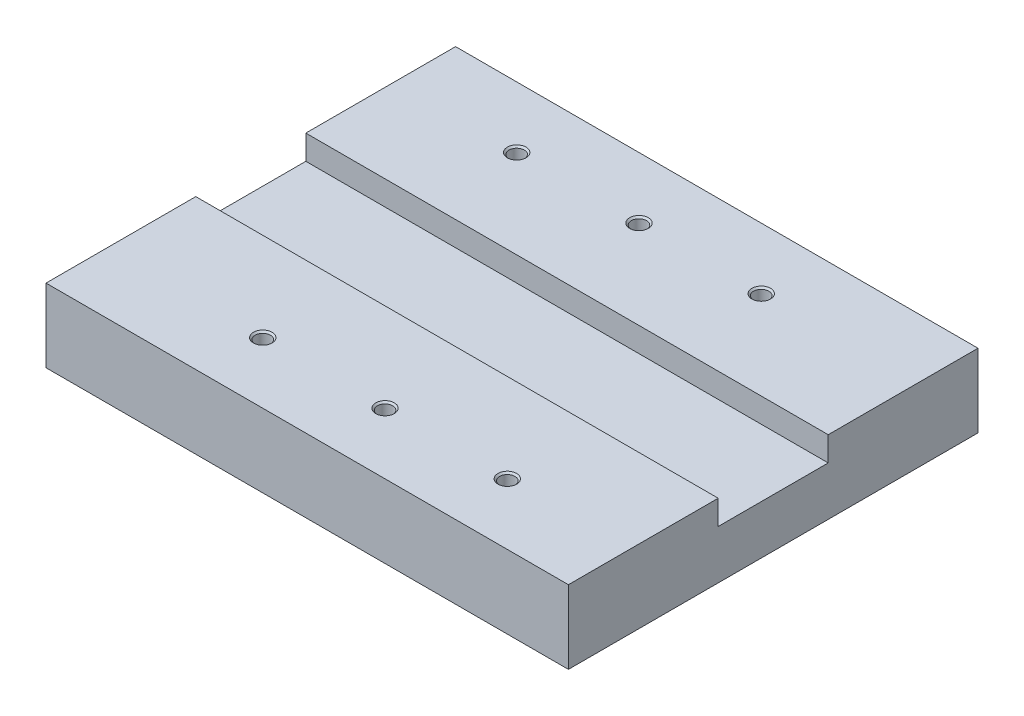
ISO-10303-21;
HEADER;
FILE_DESCRIPTION(('STEP AP214'),'2;1');
FILE_NAME('part.step','',(''),(''),'','','');
FILE_SCHEMA(('AUTOMOTIVE_DESIGN { 1 0 10303 214 1 1 1 1 }'));
ENDSEC;
DATA;
#1=APPLICATION_CONTEXT('core data for automotive mechanical design processes');
#2=APPLICATION_PROTOCOL_DEFINITION('international standard','automotive_design',2000,#1);
#3=PRODUCT_CONTEXT('',#1,'mechanical');
#4=PRODUCT('Part','Part','',(#3));
#5=PRODUCT_RELATED_PRODUCT_CATEGORY('part','',(#4));
#6=PRODUCT_DEFINITION_FORMATION('','',#4);
#7=PRODUCT_DEFINITION_CONTEXT('part definition',#1,'design');
#8=PRODUCT_DEFINITION('design','',#6,#7);
#9=PRODUCT_DEFINITION_SHAPE('','',#8);
#10=(LENGTH_UNIT() NAMED_UNIT(*) SI_UNIT(.MILLI.,.METRE.));
#11=(NAMED_UNIT(*) PLANE_ANGLE_UNIT() SI_UNIT($,.RADIAN.));
#12=(NAMED_UNIT(*) SI_UNIT($,.STERADIAN.) SOLID_ANGLE_UNIT());
#13=UNCERTAINTY_MEASURE_WITH_UNIT(LENGTH_MEASURE(1.E-05),#10,'distance_accuracy_value','');
#14=(GEOMETRIC_REPRESENTATION_CONTEXT(3) GLOBAL_UNCERTAINTY_ASSIGNED_CONTEXT((#13)) GLOBAL_UNIT_ASSIGNED_CONTEXT((#10,
#11,#12)) REPRESENTATION_CONTEXT('',''));
#15=CARTESIAN_POINT('',(0.,0.,0.));
#16=DIRECTION('',(0.,0.,1.));
#17=DIRECTION('',(1.,0.,0.));
#18=AXIS2_PLACEMENT_3D('',#15,#16,#17);
#19=CARTESIAN_POINT('',(0.,12.,0.));
#20=DIRECTION('',(0.,1.,0.));
#21=DIRECTION('',(0.,0.,1.));
#22=AXIS2_PLACEMENT_3D('',#19,#20,#21);
#23=PLANE('',#22);
#24=CARTESIAN_POINT('',(170.,12.,-96.4322129438916));
#25=DIRECTION('',(0.,1.,0.));
#26=DIRECTION('',(0.,0.,1.));
#27=AXIS2_PLACEMENT_3D('',#24,#25,#26);
#28=CIRCLE('',#27,1.525);
#29=CARTESIAN_POINT('',(170.,12.,-94.9072129438916));
#30=VERTEX_POINT('',#29);
#31=EDGE_CURVE('E261',#30,#30,#28,.T.);
#32=ORIENTED_EDGE('',*,*,#31,.F.);
#33=EDGE_LOOP('',(#32));
#34=FACE_BOUND('',#33,.T.);
#35=CARTESIAN_POINT('',(150.,12.,-96.4322129438916));
#36=DIRECTION('',(0.,1.,0.));
#37=DIRECTION('',(0.,0.,1.));
#38=AXIS2_PLACEMENT_3D('',#35,#36,#37);
#39=CIRCLE('',#38,1.525);
#40=CARTESIAN_POINT('',(150.,12.,-94.9072129438916));
#41=VERTEX_POINT('',#40);
#42=EDGE_CURVE('E252',#41,#41,#39,.T.);
#43=ORIENTED_EDGE('',*,*,#42,.F.);
#44=EDGE_LOOP('',(#43));
#45=FACE_BOUND('',#44,.T.);
#46=CARTESIAN_POINT('',(130.,12.,-96.4322129438916));
#47=DIRECTION('',(0.,1.,0.));
#48=DIRECTION('',(0.,0.,1.));
#49=AXIS2_PLACEMENT_3D('',#46,#47,#48);
#50=CIRCLE('',#49,1.525);
#51=CARTESIAN_POINT('',(130.,12.,-94.9072129438916));
#52=VERTEX_POINT('',#51);
#53=EDGE_CURVE('E243',#52,#52,#50,.T.);
#54=ORIENTED_EDGE('',*,*,#53,.F.);
#55=EDGE_LOOP('',(#54));
#56=FACE_BOUND('',#55,.T.);
#57=DIRECTION('',(1.,0.,0.));
#58=VECTOR('',#57,1.);
#59=CARTESIAN_POINT('',(104.54,12.,-110.932212943892));
#60=LINE('',#59,#58);
#61=CARTESIAN_POINT('',(104.54,12.,-110.932212943892));
#62=VERTEX_POINT('',#61);
#63=CARTESIAN_POINT('',(190.,12.,-110.932212943892));
#64=VERTEX_POINT('',#63);
#65=EDGE_CURVE('E142',#62,#64,#60,.T.);
#66=ORIENTED_EDGE('',*,*,#65,.F.);
#67=DIRECTION('',(0.,0.,1.));
#68=VECTOR('',#67,1.);
#69=CARTESIAN_POINT('',(104.54,12.,-153.432212943892));
#70=LINE('',#69,#68);
#71=CARTESIAN_POINT('',(104.54,12.,-86.4322129438916));
#72=VERTEX_POINT('',#71);
#73=EDGE_CURVE('E89',#62,#72,#70,.T.);
#74=ORIENTED_EDGE('',*,*,#73,.T.);
#75=DIRECTION('',(1.,0.,0.));
#76=VECTOR('',#75,1.);
#77=CARTESIAN_POINT('',(104.54,12.,-86.4322129438916));
#78=LINE('',#77,#76);
#79=CARTESIAN_POINT('',(190.,12.,-86.4322129438916));
#80=VERTEX_POINT('',#79);
#81=EDGE_CURVE('E150',#72,#80,#78,.T.);
#82=ORIENTED_EDGE('',*,*,#81,.T.);
#83=DIRECTION('',(0.,0.,-1.));
#84=VECTOR('',#83,1.);
#85=CARTESIAN_POINT('',(190.,12.,-86.4322129438916));
#86=LINE('',#85,#84);
#87=EDGE_CURVE('E153',#80,#64,#86,.T.);
#88=ORIENTED_EDGE('',*,*,#87,.T.);
#89=EDGE_LOOP('',(#66,#74,#82,#88));
#90=FACE_BOUND('',#89,.T.);
#91=ADVANCED_FACE('F36',(#34,#45,#56,#90),#23,.T.);
#92=CARTESIAN_POINT('',(104.54,12.,-153.432212943892));
#93=DIRECTION('',(1.,0.,0.));
#94=DIRECTION('',(0.,0.,-1.));
#95=AXIS2_PLACEMENT_3D('',#92,#93,#94);
#96=PLANE('',#95);
#97=ORIENTED_EDGE('',*,*,#73,.F.);
#98=DIRECTION('',(0.,-1.,0.));
#99=VECTOR('',#98,1.);
#100=CARTESIAN_POINT('',(104.54,12.,-110.932212943892));
#101=LINE('',#100,#99);
#102=CARTESIAN_POINT('',(104.54,8.,-110.932212943892));
#103=VERTEX_POINT('',#102);
#104=EDGE_CURVE('E115',#62,#103,#101,.T.);
#105=ORIENTED_EDGE('',*,*,#104,.T.);
#106=DIRECTION('',(0.,0.,-1.));
#107=VECTOR('',#106,1.);
#108=CARTESIAN_POINT('',(104.54,8.,-110.932212943892));
#109=LINE('',#108,#107);
#110=CARTESIAN_POINT('',(104.54,8.,-128.932212943892));
#111=VERTEX_POINT('',#110);
#112=EDGE_CURVE('E125',#103,#111,#109,.T.);
#113=ORIENTED_EDGE('',*,*,#112,.T.);
#114=DIRECTION('',(0.,1.,0.));
#115=VECTOR('',#114,1.);
#116=CARTESIAN_POINT('',(104.54,12.,-128.932212943892));
#117=LINE('',#116,#115);
#118=CARTESIAN_POINT('',(104.54,12.,-128.932212943892));
#119=VERTEX_POINT('',#118);
#120=EDGE_CURVE('E122',#111,#119,#117,.T.);
#121=ORIENTED_EDGE('',*,*,#120,.T.);
#122=CARTESIAN_POINT('',(104.54,12.,-153.432212943892));
#123=VERTEX_POINT('',#122);
#124=EDGE_CURVE('E148',#123,#119,#70,.T.);
#125=ORIENTED_EDGE('',*,*,#124,.F.);
#126=DIRECTION('',(0.,-1.,0.));
#127=VECTOR('',#126,1.);
#128=CARTESIAN_POINT('',(104.54,12.,-153.432212943892));
#129=LINE('',#128,#127);
#130=CARTESIAN_POINT('',(104.54,0.,-153.432212943892));
#131=VERTEX_POINT('',#130);
#132=EDGE_CURVE('E157',#123,#131,#129,.T.);
#133=ORIENTED_EDGE('',*,*,#132,.T.);
#134=DIRECTION('',(0.,0.,1.));
#135=VECTOR('',#134,1.);
#136=CARTESIAN_POINT('',(104.54,0.,-153.432212943892));
#137=LINE('',#136,#135);
#138=CARTESIAN_POINT('',(104.54,0.,-86.4322129438916));
#139=VERTEX_POINT('',#138);
#140=EDGE_CURVE('E144',#131,#139,#137,.T.);
#141=ORIENTED_EDGE('',*,*,#140,.T.);
#142=DIRECTION('',(0.,-1.,0.));
#143=VECTOR('',#142,1.);
#144=CARTESIAN_POINT('',(104.54,12.,-86.4322129438916));
#145=LINE('',#144,#143);
#146=EDGE_CURVE('E11',#72,#139,#145,.T.);
#147=ORIENTED_EDGE('',*,*,#146,.F.);
#148=EDGE_LOOP('',(#97,#105,#113,#121,#125,#133,#141,#147));
#149=FACE_BOUND('',#148,.T.);
#150=ADVANCED_FACE('F38',(#149),#96,.F.);
#151=CARTESIAN_POINT('',(104.54,12.,-86.4322129438916));
#152=DIRECTION('',(0.,0.,-1.));
#153=DIRECTION('',(-1.,0.,0.));
#154=AXIS2_PLACEMENT_3D('',#151,#152,#153);
#155=PLANE('',#154);
#156=DIRECTION('',(1.,0.,0.));
#157=VECTOR('',#156,1.);
#158=CARTESIAN_POINT('',(104.54,0.,-86.4322129438916));
#159=LINE('',#158,#157);
#160=CARTESIAN_POINT('',(190.,0.,-86.4322129438916));
#161=VERTEX_POINT('',#160);
#162=EDGE_CURVE('E160',#139,#161,#159,.T.);
#163=ORIENTED_EDGE('',*,*,#162,.T.);
#164=DIRECTION('',(0.,-1.,0.));
#165=VECTOR('',#164,1.);
#166=CARTESIAN_POINT('',(190.,12.,-86.4322129438916));
#167=LINE('',#166,#165);
#168=EDGE_CURVE('E44',#80,#161,#167,.T.);
#169=ORIENTED_EDGE('',*,*,#168,.F.);
#170=ORIENTED_EDGE('',*,*,#81,.F.);
#171=ORIENTED_EDGE('',*,*,#146,.T.);
#172=EDGE_LOOP('',(#163,#169,#170,#171));
#173=FACE_BOUND('',#172,.T.);
#174=ADVANCED_FACE('F183',(#173),#155,.F.);
#175=CARTESIAN_POINT('',(190.,12.,-86.4322129438916));
#176=DIRECTION('',(-1.,0.,0.));
#177=DIRECTION('',(0.,0.,1.));
#178=AXIS2_PLACEMENT_3D('',#175,#176,#177);
#179=PLANE('',#178);
#180=DIRECTION('',(0.,0.,-1.));
#181=VECTOR('',#180,1.);
#182=CARTESIAN_POINT('',(190.,8.,-110.932212943892));
#183=LINE('',#182,#181);
#184=CARTESIAN_POINT('',(190.,8.,-110.932212943892));
#185=VERTEX_POINT('',#184);
#186=CARTESIAN_POINT('',(190.,8.,-128.932212943892));
#187=VERTEX_POINT('',#186);
#188=EDGE_CURVE('E133',#185,#187,#183,.T.);
#189=ORIENTED_EDGE('',*,*,#188,.F.);
#190=DIRECTION('',(0.,-1.,0.));
#191=VECTOR('',#190,1.);
#192=CARTESIAN_POINT('',(190.,12.,-110.932212943892));
#193=LINE('',#192,#191);
#194=EDGE_CURVE('E117',#64,#185,#193,.T.);
#195=ORIENTED_EDGE('',*,*,#194,.F.);
#196=ORIENTED_EDGE('',*,*,#87,.F.);
#197=ORIENTED_EDGE('',*,*,#168,.T.);
#198=DIRECTION('',(0.,0.,-1.));
#199=VECTOR('',#198,1.);
#200=CARTESIAN_POINT('',(190.,0.,-86.4322129438916));
#201=LINE('',#200,#199);
#202=CARTESIAN_POINT('',(190.,0.,-153.432212943892));
#203=VERTEX_POINT('',#202);
#204=EDGE_CURVE('E162',#161,#203,#201,.T.);
#205=ORIENTED_EDGE('',*,*,#204,.T.);
#206=DIRECTION('',(0.,-1.,0.));
#207=VECTOR('',#206,1.);
#208=CARTESIAN_POINT('',(190.,12.,-153.432212943892));
#209=LINE('',#208,#207);
#210=CARTESIAN_POINT('',(190.,12.,-153.432212943892));
#211=VERTEX_POINT('',#210);
#212=EDGE_CURVE('E166',#211,#203,#209,.T.);
#213=ORIENTED_EDGE('',*,*,#212,.F.);
#214=CARTESIAN_POINT('',(190.,12.,-128.932212943892));
#215=VERTEX_POINT('',#214);
#216=EDGE_CURVE('E152',#215,#211,#86,.T.);
#217=ORIENTED_EDGE('',*,*,#216,.F.);
#218=DIRECTION('',(0.,1.,0.));
#219=VECTOR('',#218,1.);
#220=CARTESIAN_POINT('',(190.,12.,-128.932212943892));
#221=LINE('',#220,#219);
#222=EDGE_CURVE('E51',#187,#215,#221,.T.);
#223=ORIENTED_EDGE('',*,*,#222,.F.);
#224=EDGE_LOOP('',(#189,#195,#196,#197,#205,#213,#217,#223));
#225=FACE_BOUND('',#224,.T.);
#226=ADVANCED_FACE('F172',(#225),#179,.F.);
#227=CARTESIAN_POINT('',(190.,12.,-153.432212943892));
#228=DIRECTION('',(0.,0.,1.));
#229=DIRECTION('',(1.,0.,0.));
#230=AXIS2_PLACEMENT_3D('',#227,#228,#229);
#231=PLANE('',#230);
#232=DIRECTION('',(-1.,0.,0.));
#233=VECTOR('',#232,1.);
#234=CARTESIAN_POINT('',(190.,0.,-153.432212943892));
#235=LINE('',#234,#233);
#236=EDGE_CURVE('E81',#203,#131,#235,.T.);
#237=ORIENTED_EDGE('',*,*,#236,.T.);
#238=ORIENTED_EDGE('',*,*,#132,.F.);
#239=DIRECTION('',(-1.,0.,0.));
#240=VECTOR('',#239,1.);
#241=CARTESIAN_POINT('',(190.,12.,-153.432212943892));
#242=LINE('',#241,#240);
#243=EDGE_CURVE('E60',#211,#123,#242,.T.);
#244=ORIENTED_EDGE('',*,*,#243,.F.);
#245=ORIENTED_EDGE('',*,*,#212,.T.);
#246=EDGE_LOOP('',(#237,#238,#244,#245));
#247=FACE_BOUND('',#246,.T.);
#248=ADVANCED_FACE('F179',(#247),#231,.F.);
#249=CARTESIAN_POINT('',(164.54,12.,-143.432212943892));
#250=DIRECTION('',(0.,1.,0.));
#251=DIRECTION('',(0.,0.,1.));
#252=AXIS2_PLACEMENT_3D('',#249,#250,#251);
#253=CIRCLE('',#252,1.525);
#254=CARTESIAN_POINT('',(164.54,12.,-141.907212943892));
#255=VERTEX_POINT('',#254);
#256=EDGE_CURVE('E210',#255,#255,#253,.T.);
#257=ORIENTED_EDGE('',*,*,#256,.F.);
#258=EDGE_LOOP('',(#257));
#259=FACE_BOUND('',#258,.T.);
#260=CARTESIAN_POINT('',(144.54,12.,-143.432212943892));
#261=DIRECTION('',(0.,1.,0.));
#262=DIRECTION('',(0.,0.,1.));
#263=AXIS2_PLACEMENT_3D('',#260,#261,#262);
#264=CIRCLE('',#263,1.525);
#265=CARTESIAN_POINT('',(144.54,12.,-141.907212943892));
#266=VERTEX_POINT('',#265);
#267=EDGE_CURVE('E214',#266,#266,#264,.T.);
#268=ORIENTED_EDGE('',*,*,#267,.F.);
#269=EDGE_LOOP('',(#268));
#270=FACE_BOUND('',#269,.T.);
#271=CARTESIAN_POINT('',(124.54,12.,-143.432212943892));
#272=DIRECTION('',(0.,1.,0.));
#273=DIRECTION('',(0.,0.,1.));
#274=AXIS2_PLACEMENT_3D('',#271,#272,#273);
#275=CIRCLE('',#274,1.525);
#276=CARTESIAN_POINT('',(124.54,12.,-141.907212943892));
#277=VERTEX_POINT('',#276);
#278=EDGE_CURVE('E217',#277,#277,#275,.T.);
#279=ORIENTED_EDGE('',*,*,#278,.F.);
#280=EDGE_LOOP('',(#279));
#281=FACE_BOUND('',#280,.T.);
#282=DIRECTION('',(1.,0.,0.));
#283=VECTOR('',#282,1.);
#284=CARTESIAN_POINT('',(104.54,12.,-128.932212943892));
#285=LINE('',#284,#283);
#286=EDGE_CURVE('E145',#119,#215,#285,.T.);
#287=ORIENTED_EDGE('',*,*,#286,.T.);
#288=ORIENTED_EDGE('',*,*,#216,.T.);
#289=ORIENTED_EDGE('',*,*,#243,.T.);
#290=ORIENTED_EDGE('',*,*,#124,.T.);
#291=EDGE_LOOP('',(#287,#288,#289,#290));
#292=FACE_BOUND('',#291,.T.);
#293=ADVANCED_FACE('F181',(#259,#270,#281,#292),#23,.T.);
#294=CARTESIAN_POINT('',(0.,0.,0.));
#295=DIRECTION('',(0.,1.,0.));
#296=DIRECTION('',(0.,0.,1.));
#297=AXIS2_PLACEMENT_3D('',#294,#295,#296);
#298=PLANE('',#297);
#299=CARTESIAN_POINT('',(170.,0.,-96.4322129438916));
#300=DIRECTION('',(0.,1.,0.));
#301=DIRECTION('',(0.,0.,1.));
#302=AXIS2_PLACEMENT_3D('',#299,#300,#301);
#303=CIRCLE('',#302,1.25);
#304=CARTESIAN_POINT('',(170.,0.,-95.1822129438916));
#305=VERTEX_POINT('',#304);
#306=EDGE_CURVE('E255',#305,#305,#303,.T.);
#307=ORIENTED_EDGE('',*,*,#306,.T.);
#308=EDGE_LOOP('',(#307));
#309=FACE_BOUND('',#308,.T.);
#310=CARTESIAN_POINT('',(150.,0.,-96.4322129438916));
#311=DIRECTION('',(0.,1.,0.));
#312=DIRECTION('',(0.,0.,1.));
#313=AXIS2_PLACEMENT_3D('',#310,#311,#312);
#314=CIRCLE('',#313,1.25);
#315=CARTESIAN_POINT('',(150.,0.,-95.1822129438916));
#316=VERTEX_POINT('',#315);
#317=EDGE_CURVE('E246',#316,#316,#314,.T.);
#318=ORIENTED_EDGE('',*,*,#317,.T.);
#319=EDGE_LOOP('',(#318));
#320=FACE_BOUND('',#319,.T.);
#321=CARTESIAN_POINT('',(130.,0.,-96.4322129438916));
#322=DIRECTION('',(0.,1.,0.));
#323=DIRECTION('',(0.,0.,1.));
#324=AXIS2_PLACEMENT_3D('',#321,#322,#323);
#325=CIRCLE('',#324,1.25);
#326=CARTESIAN_POINT('',(130.,0.,-95.1822129438916));
#327=VERTEX_POINT('',#326);
#328=EDGE_CURVE('E237',#327,#327,#325,.T.);
#329=ORIENTED_EDGE('',*,*,#328,.T.);
#330=EDGE_LOOP('',(#329));
#331=FACE_BOUND('',#330,.T.);
#332=CARTESIAN_POINT('',(164.54,0.,-143.432212943892));
#333=DIRECTION('',(0.,1.,0.));
#334=DIRECTION('',(0.,0.,1.));
#335=AXIS2_PLACEMENT_3D('',#332,#333,#334);
#336=CIRCLE('',#335,1.25);
#337=CARTESIAN_POINT('',(164.54,0.,-142.182212943892));
#338=VERTEX_POINT('',#337);
#339=EDGE_CURVE('E230',#338,#338,#336,.T.);
#340=ORIENTED_EDGE('',*,*,#339,.T.);
#341=EDGE_LOOP('',(#340));
#342=FACE_BOUND('',#341,.T.);
#343=CARTESIAN_POINT('',(144.54,0.,-143.432212943892));
#344=DIRECTION('',(0.,1.,0.));
#345=DIRECTION('',(0.,0.,1.));
#346=AXIS2_PLACEMENT_3D('',#343,#344,#345);
#347=CIRCLE('',#346,1.25);
#348=CARTESIAN_POINT('',(144.54,0.,-142.182212943892));
#349=VERTEX_POINT('',#348);
#350=EDGE_CURVE('E220',#349,#349,#347,.T.);
#351=ORIENTED_EDGE('',*,*,#350,.T.);
#352=EDGE_LOOP('',(#351));
#353=FACE_BOUND('',#352,.T.);
#354=CARTESIAN_POINT('',(124.54,0.,-143.432212943892));
#355=DIRECTION('',(0.,1.,0.));
#356=DIRECTION('',(0.,0.,1.));
#357=AXIS2_PLACEMENT_3D('',#354,#355,#356);
#358=CIRCLE('',#357,1.25);
#359=CARTESIAN_POINT('',(124.54,0.,-142.182212943892));
#360=VERTEX_POINT('',#359);
#361=EDGE_CURVE('E136',#360,#360,#358,.T.);
#362=ORIENTED_EDGE('',*,*,#361,.T.);
#363=EDGE_LOOP('',(#362));
#364=FACE_BOUND('',#363,.T.);
#365=ORIENTED_EDGE('',*,*,#140,.F.);
#366=ORIENTED_EDGE('',*,*,#236,.F.);
#367=ORIENTED_EDGE('',*,*,#204,.F.);
#368=ORIENTED_EDGE('',*,*,#162,.F.);
#369=EDGE_LOOP('',(#365,#366,#367,#368));
#370=FACE_BOUND('',#369,.T.);
#371=ADVANCED_FACE('F177',(#309,#320,#331,#342,#353,#364,#370),#298,.F.);
#372=CARTESIAN_POINT('',(104.54,12.,-110.932212943892));
#373=DIRECTION('',(0.,0.,1.));
#374=DIRECTION('',(0.,-1.,0.));
#375=AXIS2_PLACEMENT_3D('',#372,#373,#374);
#376=PLANE('',#375);
#377=ORIENTED_EDGE('',*,*,#194,.T.);
#378=DIRECTION('',(1.,0.,0.));
#379=VECTOR('',#378,1.);
#380=CARTESIAN_POINT('',(104.54,8.,-110.932212943892));
#381=LINE('',#380,#379);
#382=EDGE_CURVE('E111',#103,#185,#381,.T.);
#383=ORIENTED_EDGE('',*,*,#382,.F.);
#384=ORIENTED_EDGE('',*,*,#104,.F.);
#385=ORIENTED_EDGE('',*,*,#65,.T.);
#386=EDGE_LOOP('',(#377,#383,#384,#385));
#387=FACE_BOUND('',#386,.T.);
#388=ADVANCED_FACE('F113',(#387),#376,.F.);
#389=CARTESIAN_POINT('',(104.54,12.,-128.932212943892));
#390=DIRECTION('',(0.,0.,-1.));
#391=DIRECTION('',(-1.,0.,0.));
#392=AXIS2_PLACEMENT_3D('',#389,#390,#391);
#393=PLANE('',#392);
#394=ORIENTED_EDGE('',*,*,#222,.T.);
#395=ORIENTED_EDGE('',*,*,#286,.F.);
#396=ORIENTED_EDGE('',*,*,#120,.F.);
#397=DIRECTION('',(1.,0.,0.));
#398=VECTOR('',#397,1.);
#399=CARTESIAN_POINT('',(104.54,8.,-128.932212943892));
#400=LINE('',#399,#398);
#401=EDGE_CURVE('E121',#111,#187,#400,.T.);
#402=ORIENTED_EDGE('',*,*,#401,.T.);
#403=EDGE_LOOP('',(#394,#395,#396,#402));
#404=FACE_BOUND('',#403,.T.);
#405=ADVANCED_FACE('F182',(#404),#393,.F.);
#406=CARTESIAN_POINT('',(104.54,8.,-110.932212943892));
#407=DIRECTION('',(0.,-1.,0.));
#408=DIRECTION('',(0.,0.,-1.));
#409=AXIS2_PLACEMENT_3D('',#406,#407,#408);
#410=PLANE('',#409);
#411=ORIENTED_EDGE('',*,*,#188,.T.);
#412=ORIENTED_EDGE('',*,*,#401,.F.);
#413=ORIENTED_EDGE('',*,*,#112,.F.);
#414=ORIENTED_EDGE('',*,*,#382,.T.);
#415=EDGE_LOOP('',(#411,#412,#413,#414));
#416=FACE_BOUND('',#415,.T.);
#417=ADVANCED_FACE('F126',(#416),#410,.F.);
#418=CARTESIAN_POINT('',(124.54,12.,-143.432212943892));
#419=DIRECTION('',(0.,1.,0.));
#420=DIRECTION('',(0.,0.,1.));
#421=AXIS2_PLACEMENT_3D('',#418,#419,#420);
#422=CYLINDRICAL_SURFACE('',#421,1.25);
#423=ORIENTED_EDGE('',*,*,#361,.F.);
#424=EDGE_LOOP('',(#423));
#425=FACE_BOUND('',#424,.T.);
#426=CARTESIAN_POINT('',(124.54,11.725,-143.432212943892));
#427=DIRECTION('',(0.,1.,0.));
#428=DIRECTION('',(0.,0.,1.));
#429=AXIS2_PLACEMENT_3D('',#426,#427,#428);
#430=CIRCLE('',#429,1.25);
#431=CARTESIAN_POINT('',(124.54,11.725,-142.182212943892));
#432=VERTEX_POINT('',#431);
#433=EDGE_CURVE('E219',#432,#432,#430,.T.);
#434=ORIENTED_EDGE('',*,*,#433,.T.);
#435=EDGE_LOOP('',(#434));
#436=FACE_BOUND('',#435,.T.);
#437=ADVANCED_FACE('F311',(#425,#436),#422,.F.);
#438=CARTESIAN_POINT('',(124.54,12.,-143.432212943892));
#439=DIRECTION('',(0.,1.,0.));
#440=DIRECTION('',(0.,0.,1.));
#441=AXIS2_PLACEMENT_3D('',#438,#439,#440);
#442=CONICAL_SURFACE('',#441,1.525,0.785398163397442);
#443=ORIENTED_EDGE('',*,*,#433,.F.);
#444=EDGE_LOOP('',(#443));
#445=FACE_BOUND('',#444,.T.);
#446=ORIENTED_EDGE('',*,*,#278,.T.);
#447=EDGE_LOOP('',(#446));
#448=FACE_BOUND('',#447,.T.);
#449=ADVANCED_FACE('F307',(#445,#448),#442,.F.);
#450=CARTESIAN_POINT('',(144.54,12.,-143.432212943892));
#451=DIRECTION('',(0.,1.,0.));
#452=DIRECTION('',(0.,0.,1.));
#453=AXIS2_PLACEMENT_3D('',#450,#451,#452);
#454=CYLINDRICAL_SURFACE('',#453,1.25);
#455=ORIENTED_EDGE('',*,*,#350,.F.);
#456=EDGE_LOOP('',(#455));
#457=FACE_BOUND('',#456,.T.);
#458=CARTESIAN_POINT('',(144.54,11.725,-143.432212943892));
#459=DIRECTION('',(0.,1.,0.));
#460=DIRECTION('',(0.,0.,1.));
#461=AXIS2_PLACEMENT_3D('',#458,#459,#460);
#462=CIRCLE('',#461,1.25);
#463=CARTESIAN_POINT('',(144.54,11.725,-142.182212943892));
#464=VERTEX_POINT('',#463);
#465=EDGE_CURVE('E224',#464,#464,#462,.T.);
#466=ORIENTED_EDGE('',*,*,#465,.T.);
#467=EDGE_LOOP('',(#466));
#468=FACE_BOUND('',#467,.T.);
#469=ADVANCED_FACE('F303',(#457,#468),#454,.F.);
#470=CARTESIAN_POINT('',(144.54,12.,-143.432212943892));
#471=DIRECTION('',(0.,1.,0.));
#472=DIRECTION('',(0.,0.,1.));
#473=AXIS2_PLACEMENT_3D('',#470,#471,#472);
#474=CONICAL_SURFACE('',#473,1.525,0.785398163397442);
#475=ORIENTED_EDGE('',*,*,#465,.F.);
#476=EDGE_LOOP('',(#475));
#477=FACE_BOUND('',#476,.T.);
#478=ORIENTED_EDGE('',*,*,#267,.T.);
#479=EDGE_LOOP('',(#478));
#480=FACE_BOUND('',#479,.T.);
#481=ADVANCED_FACE('F299',(#477,#480),#474,.F.);
#482=CARTESIAN_POINT('',(164.54,12.,-143.432212943892));
#483=DIRECTION('',(0.,1.,0.));
#484=DIRECTION('',(0.,0.,1.));
#485=AXIS2_PLACEMENT_3D('',#482,#483,#484);
#486=CYLINDRICAL_SURFACE('',#485,1.25);
#487=ORIENTED_EDGE('',*,*,#339,.F.);
#488=EDGE_LOOP('',(#487));
#489=FACE_BOUND('',#488,.T.);
#490=CARTESIAN_POINT('',(164.54,11.725,-143.432212943892));
#491=DIRECTION('',(0.,1.,0.));
#492=DIRECTION('',(0.,0.,1.));
#493=AXIS2_PLACEMENT_3D('',#490,#491,#492);
#494=CIRCLE('',#493,1.25);
#495=CARTESIAN_POINT('',(164.54,11.725,-142.182212943892));
#496=VERTEX_POINT('',#495);
#497=EDGE_CURVE('E233',#496,#496,#494,.T.);
#498=ORIENTED_EDGE('',*,*,#497,.T.);
#499=EDGE_LOOP('',(#498));
#500=FACE_BOUND('',#499,.T.);
#501=ADVANCED_FACE('F295',(#489,#500),#486,.F.);
#502=CARTESIAN_POINT('',(164.54,12.,-143.432212943892));
#503=DIRECTION('',(0.,1.,0.));
#504=DIRECTION('',(0.,0.,1.));
#505=AXIS2_PLACEMENT_3D('',#502,#503,#504);
#506=CONICAL_SURFACE('',#505,1.525,0.785398163397442);
#507=ORIENTED_EDGE('',*,*,#497,.F.);
#508=EDGE_LOOP('',(#507));
#509=FACE_BOUND('',#508,.T.);
#510=ORIENTED_EDGE('',*,*,#256,.T.);
#511=EDGE_LOOP('',(#510));
#512=FACE_BOUND('',#511,.T.);
#513=ADVANCED_FACE('F291',(#509,#512),#506,.F.);
#514=CARTESIAN_POINT('',(130.,12.,-96.4322129438916));
#515=DIRECTION('',(0.,1.,0.));
#516=DIRECTION('',(0.,0.,1.));
#517=AXIS2_PLACEMENT_3D('',#514,#515,#516);
#518=CYLINDRICAL_SURFACE('',#517,1.25);
#519=ORIENTED_EDGE('',*,*,#328,.F.);
#520=EDGE_LOOP('',(#519));
#521=FACE_BOUND('',#520,.T.);
#522=CARTESIAN_POINT('',(130.,11.725,-96.4322129438916));
#523=DIRECTION('',(0.,1.,0.));
#524=DIRECTION('',(0.,0.,1.));
#525=AXIS2_PLACEMENT_3D('',#522,#523,#524);
#526=CIRCLE('',#525,1.25);
#527=CARTESIAN_POINT('',(130.,11.725,-95.1822129438916));
#528=VERTEX_POINT('',#527);
#529=EDGE_CURVE('E240',#528,#528,#526,.T.);
#530=ORIENTED_EDGE('',*,*,#529,.T.);
#531=EDGE_LOOP('',(#530));
#532=FACE_BOUND('',#531,.T.);
#533=ADVANCED_FACE('F287',(#521,#532),#518,.F.);
#534=CARTESIAN_POINT('',(130.,12.,-96.4322129438916));
#535=DIRECTION('',(0.,1.,0.));
#536=DIRECTION('',(0.,0.,1.));
#537=AXIS2_PLACEMENT_3D('',#534,#535,#536);
#538=CONICAL_SURFACE('',#537,1.525,0.785398163397442);
#539=ORIENTED_EDGE('',*,*,#529,.F.);
#540=EDGE_LOOP('',(#539));
#541=FACE_BOUND('',#540,.T.);
#542=ORIENTED_EDGE('',*,*,#53,.T.);
#543=EDGE_LOOP('',(#542));
#544=FACE_BOUND('',#543,.T.);
#545=ADVANCED_FACE('F283',(#541,#544),#538,.F.);
#546=CARTESIAN_POINT('',(150.,12.,-96.4322129438916));
#547=DIRECTION('',(0.,1.,0.));
#548=DIRECTION('',(0.,0.,1.));
#549=AXIS2_PLACEMENT_3D('',#546,#547,#548);
#550=CYLINDRICAL_SURFACE('',#549,1.25);
#551=ORIENTED_EDGE('',*,*,#317,.F.);
#552=EDGE_LOOP('',(#551));
#553=FACE_BOUND('',#552,.T.);
#554=CARTESIAN_POINT('',(150.,11.725,-96.4322129438916));
#555=DIRECTION('',(0.,1.,0.));
#556=DIRECTION('',(0.,0.,1.));
#557=AXIS2_PLACEMENT_3D('',#554,#555,#556);
#558=CIRCLE('',#557,1.25);
#559=CARTESIAN_POINT('',(150.,11.725,-95.1822129438916));
#560=VERTEX_POINT('',#559);
#561=EDGE_CURVE('E249',#560,#560,#558,.T.);
#562=ORIENTED_EDGE('',*,*,#561,.T.);
#563=EDGE_LOOP('',(#562));
#564=FACE_BOUND('',#563,.T.);
#565=ADVANCED_FACE('F279',(#553,#564),#550,.F.);
#566=CARTESIAN_POINT('',(150.,12.,-96.4322129438916));
#567=DIRECTION('',(0.,1.,0.));
#568=DIRECTION('',(0.,0.,1.));
#569=AXIS2_PLACEMENT_3D('',#566,#567,#568);
#570=CONICAL_SURFACE('',#569,1.525,0.785398163397442);
#571=ORIENTED_EDGE('',*,*,#561,.F.);
#572=EDGE_LOOP('',(#571));
#573=FACE_BOUND('',#572,.T.);
#574=ORIENTED_EDGE('',*,*,#42,.T.);
#575=EDGE_LOOP('',(#574));
#576=FACE_BOUND('',#575,.T.);
#577=ADVANCED_FACE('F272',(#573,#576),#570,.F.);
#578=CARTESIAN_POINT('',(170.,12.,-96.4322129438916));
#579=DIRECTION('',(0.,1.,0.));
#580=DIRECTION('',(0.,0.,1.));
#581=AXIS2_PLACEMENT_3D('',#578,#579,#580);
#582=CYLINDRICAL_SURFACE('',#581,1.25);
#583=ORIENTED_EDGE('',*,*,#306,.F.);
#584=EDGE_LOOP('',(#583));
#585=FACE_BOUND('',#584,.T.);
#586=CARTESIAN_POINT('',(170.,11.725,-96.4322129438916));
#587=DIRECTION('',(0.,1.,0.));
#588=DIRECTION('',(0.,0.,1.));
#589=AXIS2_PLACEMENT_3D('',#586,#587,#588);
#590=CIRCLE('',#589,1.25);
#591=CARTESIAN_POINT('',(170.,11.725,-95.1822129438916));
#592=VERTEX_POINT('',#591);
#593=EDGE_CURVE('E258',#592,#592,#590,.T.);
#594=ORIENTED_EDGE('',*,*,#593,.T.);
#595=EDGE_LOOP('',(#594));
#596=FACE_BOUND('',#595,.T.);
#597=ADVANCED_FACE('F266',(#585,#596),#582,.F.);
#598=CARTESIAN_POINT('',(170.,12.,-96.4322129438916));
#599=DIRECTION('',(0.,1.,0.));
#600=DIRECTION('',(0.,0.,1.));
#601=AXIS2_PLACEMENT_3D('',#598,#599,#600);
#602=CONICAL_SURFACE('',#601,1.525,0.785398163397442);
#603=ORIENTED_EDGE('',*,*,#593,.F.);
#604=EDGE_LOOP('',(#603));
#605=FACE_BOUND('',#604,.T.);
#606=ORIENTED_EDGE('',*,*,#31,.T.);
#607=EDGE_LOOP('',(#606));
#608=FACE_BOUND('',#607,.T.);
#609=ADVANCED_FACE('F264',(#605,#608),#602,.F.);
#610=CLOSED_SHELL('',(#91,#150,#174,#226,#248,#293,#371,#388,#405,#417,#437,#449,#469,#481,#501,
#513,#533,#545,#565,#577,#597,#609));
#611=MANIFOLD_SOLID_BREP('B2',#610);
#612=ADVANCED_BREP_SHAPE_REPRESENTATION('',(#18,#611),#14);
#613=SHAPE_DEFINITION_REPRESENTATION(#9,#612);
ENDSEC;
END-ISO-10303-21;
